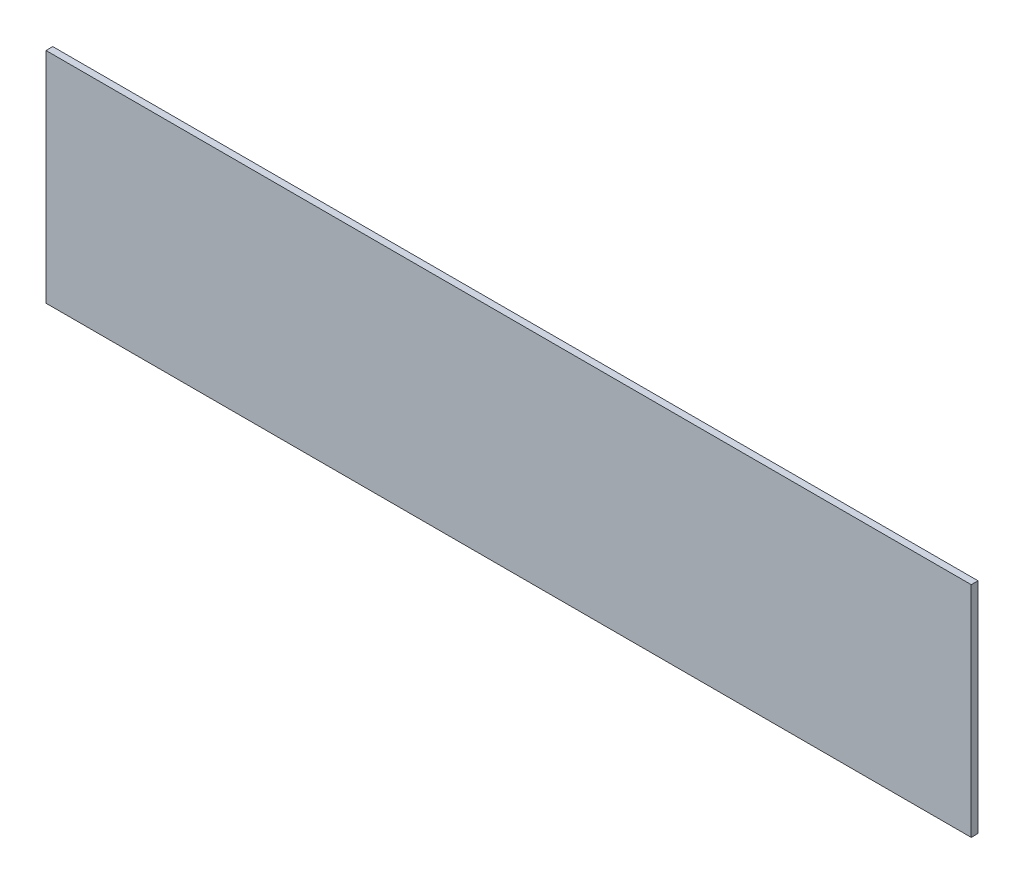
ISO-10303-21;
HEADER;
FILE_DESCRIPTION(('STEP AP214'),'2;1');
FILE_NAME('part.step','',(''),(''),'','','');
FILE_SCHEMA(('AUTOMOTIVE_DESIGN { 1 0 10303 214 1 1 1 1 }'));
ENDSEC;
DATA;
#1=APPLICATION_CONTEXT('core data for automotive mechanical design processes');
#2=APPLICATION_PROTOCOL_DEFINITION('international standard','automotive_design',2000,#1);
#3=PRODUCT_CONTEXT('',#1,'mechanical');
#4=PRODUCT('Part','Part','',(#3));
#5=PRODUCT_RELATED_PRODUCT_CATEGORY('part','',(#4));
#6=PRODUCT_DEFINITION_FORMATION('','',#4);
#7=PRODUCT_DEFINITION_CONTEXT('part definition',#1,'design');
#8=PRODUCT_DEFINITION('design','',#6,#7);
#9=PRODUCT_DEFINITION_SHAPE('','',#8);
#10=(LENGTH_UNIT() NAMED_UNIT(*) SI_UNIT(.MILLI.,.METRE.));
#11=(NAMED_UNIT(*) PLANE_ANGLE_UNIT() SI_UNIT($,.RADIAN.));
#12=(NAMED_UNIT(*) SI_UNIT($,.STERADIAN.) SOLID_ANGLE_UNIT());
#13=UNCERTAINTY_MEASURE_WITH_UNIT(LENGTH_MEASURE(1.E-05),#10,'distance_accuracy_value','');
#14=(GEOMETRIC_REPRESENTATION_CONTEXT(3) GLOBAL_UNCERTAINTY_ASSIGNED_CONTEXT((#13)) GLOBAL_UNIT_ASSIGNED_CONTEXT((#10,
#11,#12)) REPRESENTATION_CONTEXT('',''));
#15=CARTESIAN_POINT('',(0.,0.,0.));
#16=DIRECTION('',(0.,0.,1.));
#17=DIRECTION('',(1.,0.,0.));
#18=AXIS2_PLACEMENT_3D('',#15,#16,#17);
#19=CARTESIAN_POINT('',(205.,48.5,3.));
#20=DIRECTION('',(-1.,0.,0.));
#21=DIRECTION('',(0.,0.,1.));
#22=AXIS2_PLACEMENT_3D('',#19,#20,#21);
#23=PLANE('',#22);
#24=DIRECTION('',(0.,1.,0.));
#25=VECTOR('',#24,1.);
#26=CARTESIAN_POINT('',(205.,48.5,0.));
#27=LINE('',#26,#25);
#28=CARTESIAN_POINT('',(205.,-48.5,0.));
#29=VERTEX_POINT('',#28);
#30=CARTESIAN_POINT('',(205.,48.5,0.));
#31=VERTEX_POINT('',#30);
#32=EDGE_CURVE('E107',#29,#31,#27,.T.);
#33=ORIENTED_EDGE('',*,*,#32,.T.);
#34=DIRECTION('',(0.,0.,-1.));
#35=VECTOR('',#34,1.);
#36=CARTESIAN_POINT('',(205.,48.5,3.));
#37=LINE('',#36,#35);
#38=CARTESIAN_POINT('',(205.,48.5,3.));
#39=VERTEX_POINT('',#38);
#40=EDGE_CURVE('E11',#39,#31,#37,.T.);
#41=ORIENTED_EDGE('',*,*,#40,.F.);
#42=DIRECTION('',(0.,1.,0.));
#43=VECTOR('',#42,1.);
#44=CARTESIAN_POINT('',(205.,48.5,3.));
#45=LINE('',#44,#43);
#46=CARTESIAN_POINT('',(205.,-48.5,3.));
#47=VERTEX_POINT('',#46);
#48=EDGE_CURVE('E91',#47,#39,#45,.T.);
#49=ORIENTED_EDGE('',*,*,#48,.F.);
#50=DIRECTION('',(0.,0.,-1.));
#51=VECTOR('',#50,1.);
#52=CARTESIAN_POINT('',(205.,-48.5,3.));
#53=LINE('',#52,#51);
#54=EDGE_CURVE('E103',#47,#29,#53,.T.);
#55=ORIENTED_EDGE('',*,*,#54,.T.);
#56=EDGE_LOOP('',(#33,#41,#49,#55));
#57=FACE_BOUND('',#56,.T.);
#58=ADVANCED_FACE('F39',(#57),#23,.F.);
#59=CARTESIAN_POINT('',(-205.,48.5,3.));
#60=DIRECTION('',(0.,-1.,0.));
#61=DIRECTION('',(0.,0.,-1.));
#62=AXIS2_PLACEMENT_3D('',#59,#60,#61);
#63=PLANE('',#62);
#64=DIRECTION('',(-1.,0.,0.));
#65=VECTOR('',#64,1.);
#66=CARTESIAN_POINT('',(-205.,48.5,0.));
#67=LINE('',#66,#65);
#68=CARTESIAN_POINT('',(-205.,48.5,0.));
#69=VERTEX_POINT('',#68);
#70=EDGE_CURVE('E96',#31,#69,#67,.T.);
#71=ORIENTED_EDGE('',*,*,#70,.T.);
#72=DIRECTION('',(0.,0.,-1.));
#73=VECTOR('',#72,1.);
#74=CARTESIAN_POINT('',(-205.,48.5,3.));
#75=LINE('',#74,#73);
#76=CARTESIAN_POINT('',(-205.,48.5,3.));
#77=VERTEX_POINT('',#76);
#78=EDGE_CURVE('E48',#77,#69,#75,.T.);
#79=ORIENTED_EDGE('',*,*,#78,.F.);
#80=DIRECTION('',(-1.,0.,0.));
#81=VECTOR('',#80,1.);
#82=CARTESIAN_POINT('',(-205.,48.5,3.));
#83=LINE('',#82,#81);
#84=EDGE_CURVE('E86',#39,#77,#83,.T.);
#85=ORIENTED_EDGE('',*,*,#84,.F.);
#86=ORIENTED_EDGE('',*,*,#40,.T.);
#87=EDGE_LOOP('',(#71,#79,#85,#86));
#88=FACE_BOUND('',#87,.T.);
#89=ADVANCED_FACE('F95',(#88),#63,.F.);
#90=CARTESIAN_POINT('',(-205.,48.5,3.));
#91=DIRECTION('',(1.,0.,0.));
#92=DIRECTION('',(0.,0.,-1.));
#93=AXIS2_PLACEMENT_3D('',#90,#91,#92);
#94=PLANE('',#93);
#95=DIRECTION('',(0.,-1.,0.));
#96=VECTOR('',#95,1.);
#97=CARTESIAN_POINT('',(-205.,48.5,0.));
#98=LINE('',#97,#96);
#99=CARTESIAN_POINT('',(-205.,-48.5,0.));
#100=VERTEX_POINT('',#99);
#101=EDGE_CURVE('E73',#69,#100,#98,.T.);
#102=ORIENTED_EDGE('',*,*,#101,.T.);
#103=DIRECTION('',(0.,0.,-1.));
#104=VECTOR('',#103,1.);
#105=CARTESIAN_POINT('',(-205.,-48.5,3.));
#106=LINE('',#105,#104);
#107=CARTESIAN_POINT('',(-205.,-48.5,3.));
#108=VERTEX_POINT('',#107);
#109=EDGE_CURVE('E98',#108,#100,#106,.T.);
#110=ORIENTED_EDGE('',*,*,#109,.F.);
#111=DIRECTION('',(0.,-1.,0.));
#112=VECTOR('',#111,1.);
#113=CARTESIAN_POINT('',(-205.,48.5,3.));
#114=LINE('',#113,#112);
#115=EDGE_CURVE('E89',#77,#108,#114,.T.);
#116=ORIENTED_EDGE('',*,*,#115,.F.);
#117=ORIENTED_EDGE('',*,*,#78,.T.);
#118=EDGE_LOOP('',(#102,#110,#116,#117));
#119=FACE_BOUND('',#118,.T.);
#120=ADVANCED_FACE('F99',(#119),#94,.F.);
#121=CARTESIAN_POINT('',(-205.,-48.5,3.));
#122=DIRECTION('',(0.,1.,0.));
#123=DIRECTION('',(0.,0.,1.));
#124=AXIS2_PLACEMENT_3D('',#121,#122,#123);
#125=PLANE('',#124);
#126=DIRECTION('',(1.,0.,0.));
#127=VECTOR('',#126,1.);
#128=CARTESIAN_POINT('',(-205.,-48.5,0.));
#129=LINE('',#128,#127);
#130=EDGE_CURVE('E79',#100,#29,#129,.T.);
#131=ORIENTED_EDGE('',*,*,#130,.T.);
#132=ORIENTED_EDGE('',*,*,#54,.F.);
#133=DIRECTION('',(1.,0.,0.));
#134=VECTOR('',#133,1.);
#135=CARTESIAN_POINT('',(-205.,-48.5,3.));
#136=LINE('',#135,#134);
#137=EDGE_CURVE('E56',#108,#47,#136,.T.);
#138=ORIENTED_EDGE('',*,*,#137,.F.);
#139=ORIENTED_EDGE('',*,*,#109,.T.);
#140=EDGE_LOOP('',(#131,#132,#138,#139));
#141=FACE_BOUND('',#140,.T.);
#142=ADVANCED_FACE('F120',(#141),#125,.F.);
#143=CARTESIAN_POINT('',(0.,0.,3.));
#144=DIRECTION('',(0.,0.,1.));
#145=DIRECTION('',(1.,0.,0.));
#146=AXIS2_PLACEMENT_3D('',#143,#144,#145);
#147=PLANE('',#146);
#148=ORIENTED_EDGE('',*,*,#48,.T.);
#149=ORIENTED_EDGE('',*,*,#84,.T.);
#150=ORIENTED_EDGE('',*,*,#115,.T.);
#151=ORIENTED_EDGE('',*,*,#137,.T.);
#152=EDGE_LOOP('',(#148,#149,#150,#151));
#153=FACE_BOUND('',#152,.T.);
#154=ADVANCED_FACE('F87',(#153),#147,.T.);
#155=CARTESIAN_POINT('',(0.,0.,0.));
#156=DIRECTION('',(0.,0.,1.));
#157=DIRECTION('',(1.,0.,0.));
#158=AXIS2_PLACEMENT_3D('',#155,#156,#157);
#159=PLANE('',#158);
#160=ORIENTED_EDGE('',*,*,#32,.F.);
#161=ORIENTED_EDGE('',*,*,#130,.F.);
#162=ORIENTED_EDGE('',*,*,#101,.F.);
#163=ORIENTED_EDGE('',*,*,#70,.F.);
#164=EDGE_LOOP('',(#160,#161,#162,#163));
#165=FACE_BOUND('',#164,.T.);
#166=ADVANCED_FACE('F123',(#165),#159,.F.);
#167=CLOSED_SHELL('',(#58,#89,#120,#142,#154,#166));
#168=MANIFOLD_SOLID_BREP('B2',#167);
#169=ADVANCED_BREP_SHAPE_REPRESENTATION('',(#18,#168),#14);
#170=SHAPE_DEFINITION_REPRESENTATION(#9,#169);
ENDSEC;
END-ISO-10303-21;
